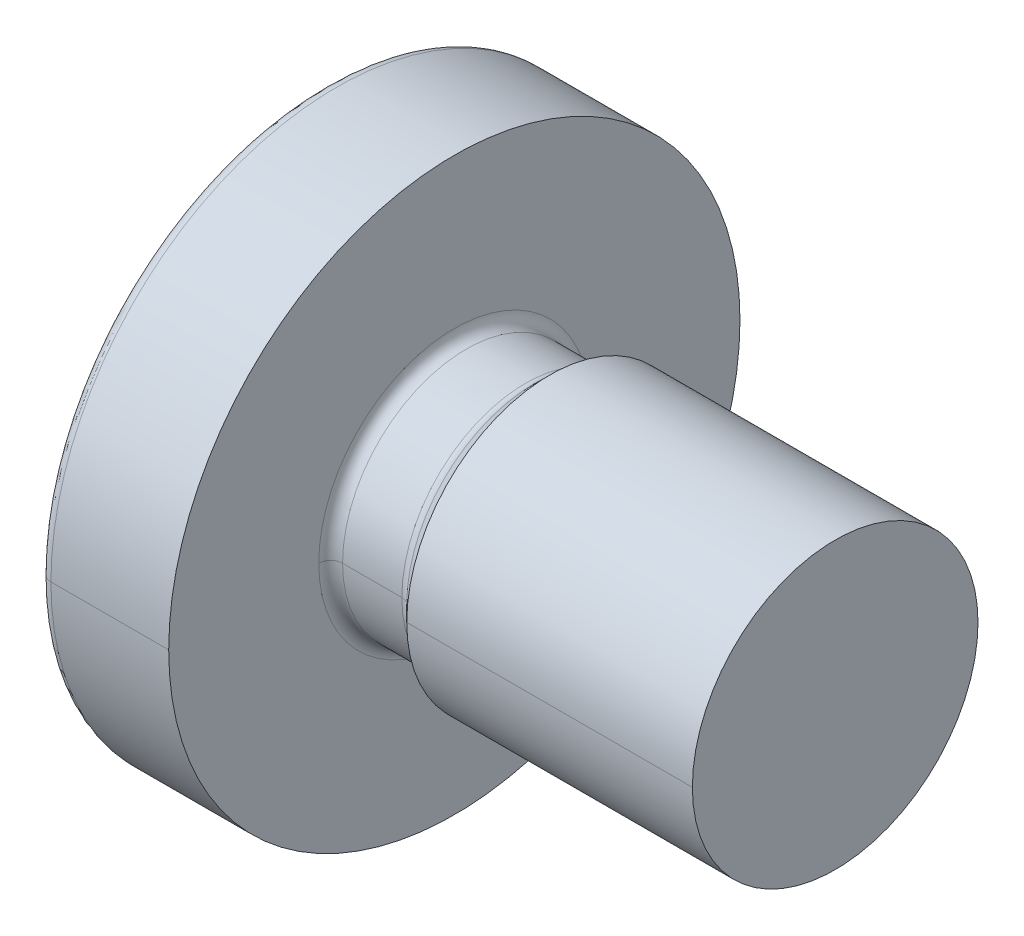
ISO-10303-21;
HEADER;
FILE_DESCRIPTION(('STEP AP214'),'2;1');
FILE_NAME('part.step','',(''),(''),'','','');
FILE_SCHEMA(('AUTOMOTIVE_DESIGN { 1 0 10303 214 1 1 1 1 }'));
ENDSEC;
DATA;
#1=APPLICATION_CONTEXT('core data for automotive mechanical design processes');
#2=APPLICATION_PROTOCOL_DEFINITION('international standard','automotive_design',2000,#1);
#3=PRODUCT_CONTEXT('',#1,'mechanical');
#4=PRODUCT('Part','Part','',(#3));
#5=PRODUCT_RELATED_PRODUCT_CATEGORY('part','',(#4));
#6=PRODUCT_DEFINITION_FORMATION('','',#4);
#7=PRODUCT_DEFINITION_CONTEXT('part definition',#1,'design');
#8=PRODUCT_DEFINITION('design','',#6,#7);
#9=PRODUCT_DEFINITION_SHAPE('','',#8);
#10=(LENGTH_UNIT() NAMED_UNIT(*) SI_UNIT(.MILLI.,.METRE.));
#11=(NAMED_UNIT(*) PLANE_ANGLE_UNIT() SI_UNIT($,.RADIAN.));
#12=(NAMED_UNIT(*) SI_UNIT($,.STERADIAN.) SOLID_ANGLE_UNIT());
#13=UNCERTAINTY_MEASURE_WITH_UNIT(LENGTH_MEASURE(1.E-05),#10,'distance_accuracy_value','');
#14=(GEOMETRIC_REPRESENTATION_CONTEXT(3) GLOBAL_UNCERTAINTY_ASSIGNED_CONTEXT((#13)) GLOBAL_UNIT_ASSIGNED_CONTEXT((#10,
#11,#12)) REPRESENTATION_CONTEXT('',''));
#15=CARTESIAN_POINT('',(0.,0.,0.));
#16=DIRECTION('',(0.,0.,1.));
#17=DIRECTION('',(1.,0.,0.));
#18=AXIS2_PLACEMENT_3D('',#15,#16,#17);
#19=CARTESIAN_POINT('',(4.85,0.,0.));
#20=DIRECTION('',(-1.,0.,0.));
#21=DIRECTION('',(0.,0.,1.));
#22=AXIS2_PLACEMENT_3D('',#19,#20,#21);
#23=TOROIDAL_SURFACE('',#22,2.848,0.25);
#24=CARTESIAN_POINT('',(4.6,0.,0.));
#25=DIRECTION('',(-1.,0.,0.));
#26=DIRECTION('',(0.,0.,1.));
#27=AXIS2_PLACEMENT_3D('',#24,#25,#26);
#28=CIRCLE('',#27,2.848);
#29=CARTESIAN_POINT('',(4.6,0.,-2.848));
#30=VERTEX_POINT('',#29);
#31=CARTESIAN_POINT('',(4.6,0.,2.848));
#32=VERTEX_POINT('',#31);
#33=EDGE_CURVE('E40',#30,#32,#28,.T.);
#34=ORIENTED_EDGE('',*,*,#33,.F.);
#35=CARTESIAN_POINT('',(4.85,0.,-2.848));
#36=DIRECTION('',(0.,1.,0.));
#37=DIRECTION('',(0.,0.,1.));
#38=AXIS2_PLACEMENT_3D('',#35,#36,#37);
#39=CIRCLE('',#38,0.25);
#40=CARTESIAN_POINT('',(4.85,0.,-2.598));
#41=VERTEX_POINT('',#40);
#42=EDGE_CURVE('E10',#30,#41,#39,.T.);
#43=ORIENTED_EDGE('',*,*,#42,.T.);
#44=CARTESIAN_POINT('',(4.85,0.,0.));
#45=DIRECTION('',(1.,0.,0.));
#46=DIRECTION('',(0.,0.,1.));
#47=AXIS2_PLACEMENT_3D('',#44,#45,#46);
#48=CIRCLE('',#47,2.598);
#49=CARTESIAN_POINT('',(4.85,0.,2.598));
#50=VERTEX_POINT('',#49);
#51=EDGE_CURVE('E408',#50,#41,#48,.T.);
#52=ORIENTED_EDGE('',*,*,#51,.F.);
#53=CARTESIAN_POINT('',(4.85,0.,2.848));
#54=DIRECTION('',(0.,-1.,0.));
#55=DIRECTION('',(0.,0.,-1.));
#56=AXIS2_PLACEMENT_3D('',#53,#54,#55);
#57=CIRCLE('',#56,0.25);
#58=EDGE_CURVE('E240',#32,#50,#57,.T.);
#59=ORIENTED_EDGE('',*,*,#58,.F.);
#60=EDGE_LOOP('',(#34,#43,#52,#59));
#61=FACE_BOUND('',#60,.T.);
#62=ADVANCED_FACE('F15',(#61),#23,.F.);
#63=CARTESIAN_POINT('',(6.09444660940673,0.,0.));
#64=DIRECTION('',(-1.,0.,0.));
#65=DIRECTION('',(0.,0.,1.));
#66=AXIS2_PLACEMENT_3D('',#63,#64,#65);
#67=TOROIDAL_SURFACE('',#66,2.848,0.25);
#68=CARTESIAN_POINT('',(6.09444660940673,0.,0.));
#69=DIRECTION('',(-1.,0.,0.));
#70=DIRECTION('',(0.,0.,1.));
#71=AXIS2_PLACEMENT_3D('',#68,#69,#70);
#72=CIRCLE('',#71,2.598);
#73=CARTESIAN_POINT('',(6.09444660940673,0.,-2.598));
#74=VERTEX_POINT('',#73);
#75=CARTESIAN_POINT('',(6.09444660940673,0.,2.598));
#76=VERTEX_POINT('',#75);
#77=EDGE_CURVE('E19',#74,#76,#72,.T.);
#78=ORIENTED_EDGE('',*,*,#77,.F.);
#79=CARTESIAN_POINT('',(6.09444660940673,0.,-2.848));
#80=DIRECTION('',(0.,1.,0.));
#81=DIRECTION('',(0.,0.,1.));
#82=AXIS2_PLACEMENT_3D('',#79,#80,#81);
#83=CIRCLE('',#82,0.25);
#84=CARTESIAN_POINT('',(6.27122330470336,0.,-2.67122330470336));
#85=VERTEX_POINT('',#84);
#86=EDGE_CURVE('E26',#74,#85,#83,.T.);
#87=ORIENTED_EDGE('',*,*,#86,.T.);
#88=CARTESIAN_POINT('',(6.27122330470336,0.,0.));
#89=DIRECTION('',(1.,0.,0.));
#90=DIRECTION('',(0.,0.,-1.));
#91=AXIS2_PLACEMENT_3D('',#88,#89,#90);
#92=CIRCLE('',#91,2.67122330470336);
#93=CARTESIAN_POINT('',(6.27122330470336,0.,2.67122330470336));
#94=VERTEX_POINT('',#93);
#95=EDGE_CURVE('E496',#94,#85,#92,.T.);
#96=ORIENTED_EDGE('',*,*,#95,.F.);
#97=CARTESIAN_POINT('',(6.09444660940673,0.,2.848));
#98=DIRECTION('',(0.,-1.,0.));
#99=DIRECTION('',(0.,0.,-1.));
#100=AXIS2_PLACEMENT_3D('',#97,#98,#99);
#101=CIRCLE('',#100,0.25);
#102=EDGE_CURVE('E244',#76,#94,#101,.T.);
#103=ORIENTED_EDGE('',*,*,#102,.F.);
#104=EDGE_LOOP('',(#78,#87,#96,#103));
#105=FACE_BOUND('',#104,.T.);
#106=ADVANCED_FACE('F566',(#105),#67,.F.);
#107=CARTESIAN_POINT('',(2.12599212598819,0.,0.));
#108=DIRECTION('',(1.,0.,0.));
#109=DIRECTION('',(0.,0.,-1.));
#110=AXIS2_PLACEMENT_3D('',#107,#108,#109);
#111=TOROIDAL_SURFACE('',#110,5.75,0.25);
#112=CARTESIAN_POINT('',(1.92409448819302,0.,0.));
#113=DIRECTION('',(-1.,0.,0.));
#114=DIRECTION('',(0.,0.,-1.));
#115=AXIS2_PLACEMENT_3D('',#112,#113,#114);
#116=CIRCLE('',#115,5.8974358974359);
#117=CARTESIAN_POINT('',(1.92409448819302,0.,5.8974358974359));
#118=VERTEX_POINT('',#117);
#119=CARTESIAN_POINT('',(1.92409448819302,5.8974358974359,0.));
#120=VERTEX_POINT('',#119);
#121=EDGE_CURVE('E299',#118,#120,#116,.T.);
#122=ORIENTED_EDGE('',*,*,#121,.F.);
#123=CARTESIAN_POINT('',(2.12599212598819,0.,5.75));
#124=DIRECTION('',(0.,1.,0.));
#125=DIRECTION('',(0.,0.,1.));
#126=AXIS2_PLACEMENT_3D('',#123,#124,#125);
#127=CIRCLE('',#126,0.25);
#128=CARTESIAN_POINT('',(2.12599212598819,0.,6.));
#129=VERTEX_POINT('',#128);
#130=EDGE_CURVE('E313',#118,#129,#127,.T.);
#131=ORIENTED_EDGE('',*,*,#130,.T.);
#132=CARTESIAN_POINT('',(2.12599212598819,0.,0.));
#133=DIRECTION('',(1.,0.,0.));
#134=DIRECTION('',(0.,0.,-1.));
#135=AXIS2_PLACEMENT_3D('',#132,#133,#134);
#136=CIRCLE('',#135,6.);
#137=CARTESIAN_POINT('',(2.12599212598819,0.,-6.));
#138=VERTEX_POINT('',#137);
#139=EDGE_CURVE('E403',#138,#129,#136,.T.);
#140=ORIENTED_EDGE('',*,*,#139,.F.);
#141=CARTESIAN_POINT('',(2.12599212598819,0.,-5.75));
#142=DIRECTION('',(0.,-1.,0.));
#143=DIRECTION('',(0.,0.,-1.));
#144=AXIS2_PLACEMENT_3D('',#141,#142,#143);
#145=CIRCLE('',#144,0.25);
#146=CARTESIAN_POINT('',(1.92409448819302,0.,-5.8974358974359));
#147=VERTEX_POINT('',#146);
#148=EDGE_CURVE('E422',#147,#138,#145,.T.);
#149=ORIENTED_EDGE('',*,*,#148,.F.);
#150=CARTESIAN_POINT('',(1.92409448819302,0.,0.));
#151=DIRECTION('',(-1.,0.,0.));
#152=DIRECTION('',(0.,0.,-1.));
#153=AXIS2_PLACEMENT_3D('',#150,#151,#152);
#154=CIRCLE('',#153,5.8974358974359);
#155=EDGE_CURVE('E400',#120,#147,#154,.T.);
#156=ORIENTED_EDGE('',*,*,#155,.F.);
#157=EDGE_LOOP('',(#122,#131,#140,#149,#156));
#158=FACE_BOUND('',#157,.T.);
#159=ADVANCED_FACE('F606',(#158),#111,.T.);
#160=CARTESIAN_POINT('',(-3.4420013783492,0.,0.));
#161=DIRECTION('',(-1.,0.,0.));
#162=DIRECTION('',(0.,0.,1.));
#163=AXIS2_PLACEMENT_3D('',#160,#161,#162);
#164=CYLINDRICAL_SURFACE('',#163,3.);
#165=CARTESIAN_POINT('',(12.6,0.,0.));
#166=DIRECTION('',(-1.,0.,0.));
#167=DIRECTION('',(0.,0.,1.));
#168=AXIS2_PLACEMENT_3D('',#165,#166,#167);
#169=CIRCLE('',#168,3.);
#170=CARTESIAN_POINT('',(12.6,0.,3.));
#171=VERTEX_POINT('',#170);
#172=CARTESIAN_POINT('',(12.6,0.,-3.));
#173=VERTEX_POINT('',#172);
#174=EDGE_CURVE('E309',#171,#173,#169,.T.);
#175=ORIENTED_EDGE('',*,*,#174,.T.);
#176=DIRECTION('',(-1.,0.,0.));
#177=VECTOR('',#176,1.);
#178=CARTESIAN_POINT('',(-3.4420013783492,0.,-3.));
#179=LINE('',#178,#177);
#180=CARTESIAN_POINT('',(6.6,0.,-3.));
#181=VERTEX_POINT('',#180);
#182=EDGE_CURVE('E314',#173,#181,#179,.T.);
#183=ORIENTED_EDGE('',*,*,#182,.T.);
#184=CARTESIAN_POINT('',(6.6,0.,0.));
#185=DIRECTION('',(-1.,0.,0.));
#186=DIRECTION('',(0.,0.,1.));
#187=AXIS2_PLACEMENT_3D('',#184,#185,#186);
#188=CIRCLE('',#187,3.);
#189=CARTESIAN_POINT('',(6.6,0.,3.));
#190=VERTEX_POINT('',#189);
#191=EDGE_CURVE('E287',#190,#181,#188,.T.);
#192=ORIENTED_EDGE('',*,*,#191,.F.);
#193=DIRECTION('',(-1.,0.,0.));
#194=VECTOR('',#193,1.);
#195=CARTESIAN_POINT('',(-3.4420013783492,0.,3.));
#196=LINE('',#195,#194);
#197=EDGE_CURVE('E419',#171,#190,#196,.T.);
#198=ORIENTED_EDGE('',*,*,#197,.F.);
#199=EDGE_LOOP('',(#175,#183,#192,#198));
#200=FACE_BOUND('',#199,.T.);
#201=ADVANCED_FACE('F583',(#200),#164,.T.);
#202=CARTESIAN_POINT('',(6.6,0.,0.));
#203=DIRECTION('',(1.,0.,0.));
#204=DIRECTION('',(0.,0.,-1.));
#205=AXIS2_PLACEMENT_3D('',#202,#203,#204);
#206=CONICAL_SURFACE('',#205,3.,0.785398163397442);
#207=CARTESIAN_POINT('',(6.27122330470336,0.,0.));
#208=DIRECTION('',(1.,0.,0.));
#209=DIRECTION('',(0.,0.,-1.));
#210=AXIS2_PLACEMENT_3D('',#207,#208,#209);
#211=CIRCLE('',#210,2.67122330470336);
#212=EDGE_CURVE('E487',#85,#94,#211,.T.);
#213=ORIENTED_EDGE('',*,*,#212,.T.);
#214=DIRECTION('',(0.707106781186552,0.,0.707106781186544));
#215=VECTOR('',#214,1.);
#216=CARTESIAN_POINT('',(6.6,0.,3.));
#217=LINE('',#216,#215);
#218=EDGE_CURVE('E412',#94,#190,#217,.T.);
#219=ORIENTED_EDGE('',*,*,#218,.T.);
#220=ORIENTED_EDGE('',*,*,#191,.T.);
#221=DIRECTION('',(0.707106781186552,0.,-0.707106781186544));
#222=VECTOR('',#221,1.);
#223=CARTESIAN_POINT('',(6.6,0.,-3.));
#224=LINE('',#223,#222);
#225=EDGE_CURVE('E417',#85,#181,#224,.T.);
#226=ORIENTED_EDGE('',*,*,#225,.F.);
#227=EDGE_LOOP('',(#213,#219,#220,#226));
#228=FACE_BOUND('',#227,.T.);
#229=ADVANCED_FACE('F570',(#228),#206,.T.);
#230=CARTESIAN_POINT('',(-3.4420013783492,0.,0.));
#231=DIRECTION('',(-1.,0.,0.));
#232=DIRECTION('',(0.,0.,1.));
#233=AXIS2_PLACEMENT_3D('',#230,#231,#232);
#234=CYLINDRICAL_SURFACE('',#233,2.598);
#235=CARTESIAN_POINT('',(6.09444660940673,0.,0.));
#236=DIRECTION('',(-1.,0.,0.));
#237=DIRECTION('',(0.,0.,1.));
#238=AXIS2_PLACEMENT_3D('',#235,#236,#237);
#239=CIRCLE('',#238,2.598);
#240=EDGE_CURVE('E277',#76,#74,#239,.T.);
#241=ORIENTED_EDGE('',*,*,#240,.T.);
#242=DIRECTION('',(-1.,0.,0.));
#243=VECTOR('',#242,1.);
#244=CARTESIAN_POINT('',(-3.4420013783492,0.,-2.598));
#245=LINE('',#244,#243);
#246=EDGE_CURVE('E273',#74,#41,#245,.T.);
#247=ORIENTED_EDGE('',*,*,#246,.T.);
#248=CARTESIAN_POINT('',(4.85,0.,0.));
#249=DIRECTION('',(1.,0.,0.));
#250=DIRECTION('',(0.,0.,1.));
#251=AXIS2_PLACEMENT_3D('',#248,#249,#250);
#252=CIRCLE('',#251,2.598);
#253=EDGE_CURVE('E218',#41,#50,#252,.T.);
#254=ORIENTED_EDGE('',*,*,#253,.T.);
#255=DIRECTION('',(-1.,0.,0.));
#256=VECTOR('',#255,1.);
#257=CARTESIAN_POINT('',(-3.4420013783492,0.,2.598));
#258=LINE('',#257,#256);
#259=EDGE_CURVE('E404',#76,#50,#258,.T.);
#260=ORIENTED_EDGE('',*,*,#259,.F.);
#261=EDGE_LOOP('',(#241,#247,#254,#260));
#262=FACE_BOUND('',#261,.T.);
#263=ADVANCED_FACE('F17',(#262),#234,.T.);
#264=CARTESIAN_POINT('',(-3.4420013783492,0.,0.));
#265=DIRECTION('',(-1.,0.,0.));
#266=DIRECTION('',(0.,0.,1.));
#267=AXIS2_PLACEMENT_3D('',#264,#265,#266);
#268=CYLINDRICAL_SURFACE('',#267,6.);
#269=CARTESIAN_POINT('',(4.6,0.,0.));
#270=DIRECTION('',(-1.,0.,0.));
#271=DIRECTION('',(0.,0.,1.));
#272=AXIS2_PLACEMENT_3D('',#269,#270,#271);
#273=CIRCLE('',#272,6.);
#274=CARTESIAN_POINT('',(4.6,0.,6.));
#275=VERTEX_POINT('',#274);
#276=CARTESIAN_POINT('',(4.6,0.,-6.));
#277=VERTEX_POINT('',#276);
#278=EDGE_CURVE('E214',#275,#277,#273,.T.);
#279=ORIENTED_EDGE('',*,*,#278,.T.);
#280=DIRECTION('',(-1.,0.,0.));
#281=VECTOR('',#280,1.);
#282=CARTESIAN_POINT('',(-3.4420013783492,0.,-6.));
#283=LINE('',#282,#281);
#284=EDGE_CURVE('E219',#277,#138,#283,.T.);
#285=ORIENTED_EDGE('',*,*,#284,.T.);
#286=ORIENTED_EDGE('',*,*,#139,.T.);
#287=DIRECTION('',(-1.,0.,0.));
#288=VECTOR('',#287,1.);
#289=CARTESIAN_POINT('',(-3.4420013783492,0.,6.));
#290=LINE('',#289,#288);
#291=EDGE_CURVE('E432',#275,#129,#290,.T.);
#292=ORIENTED_EDGE('',*,*,#291,.F.);
#293=EDGE_LOOP('',(#279,#285,#286,#292));
#294=FACE_BOUND('',#293,.T.);
#295=ADVANCED_FACE('F620',(#294),#268,.T.);
#296=CARTESIAN_POINT('',(10.,0.,0.));
#297=DIRECTION('',(0.,0.,-1.));
#298=DIRECTION('',(0.,1.,0.));
#299=AXIS2_PLACEMENT_3D('',#296,#297,#298);
#300=SPHERICAL_SURFACE('',#299,10.);
#301=ORIENTED_EDGE('',*,*,#155,.T.);
#302=CARTESIAN_POINT('',(1.92409448819302,0.,0.));
#303=DIRECTION('',(-1.,0.,0.));
#304=DIRECTION('',(0.,0.,-1.));
#305=AXIS2_PLACEMENT_3D('',#302,#303,#304);
#306=CIRCLE('',#305,5.8974358974359);
#307=CARTESIAN_POINT('',(1.92409448819302,-5.8974358974359,0.));
#308=VERTEX_POINT('',#307);
#309=EDGE_CURVE('E271',#147,#308,#306,.T.);
#310=ORIENTED_EDGE('',*,*,#309,.T.);
#311=CARTESIAN_POINT('',(10.,0.,0.));
#312=DIRECTION('',(0.,0.,-1.));
#313=DIRECTION('',(0.,1.,0.));
#314=AXIS2_PLACEMENT_3D('',#311,#312,#313);
#315=CIRCLE('',#314,10.);
#316=CARTESIAN_POINT('',(0.116806208062503,-1.52396865814495,0.));
#317=VERTEX_POINT('',#316);
#318=EDGE_CURVE('E267',#308,#317,#315,.T.);
#319=ORIENTED_EDGE('',*,*,#318,.T.);
#320=CARTESIAN_POINT('',(10.0479353591547,-0.50242301570466,0.19286212610305));
#321=DIRECTION('',(0.0887201386737619,-0.929898939158985,0.356954758960715));
#322=DIRECTION('',(0.,-0.358367949545296,-0.933580426497203));
#323=AXIS2_PLACEMENT_3D('',#320,#321,#322);
#324=CIRCLE('',#323,9.98539320782852);
#325=CARTESIAN_POINT('',(0.246140300372935,-1.92467766076288,-1.07602827923962));
#326=VERTEX_POINT('',#325);
#327=EDGE_CURVE('E272',#317,#326,#324,.T.);
#328=ORIENTED_EDGE('',*,*,#327,.T.);
#329=CARTESIAN_POINT('',(9.99778730551343,0.0231918286704847,-0.0223960886143359));
#330=DIRECTION('',(0.0684699703771083,-0.717651637719428,0.693028130767562));
#331=DIRECTION('',(0.,-0.694658370458996,-0.719339800338652));
#332=AXIS2_PLACEMENT_3D('',#329,#330,#331);
#333=CIRCLE('',#332,9.99994778277771);
#334=CARTESIAN_POINT('',(0.589318944567111,-2.75177670075754,-1.96641985905463));
#335=VERTEX_POINT('',#334);
#336=EDGE_CURVE('E455',#326,#335,#333,.T.);
#337=ORIENTED_EDGE('',*,*,#336,.T.);
#338=CARTESIAN_POINT('',(9.45863544267171,0.767783130992111,0.767783130992112));
#339=DIRECTION('',(-0.446197814505031,0.632814155313759,0.63281415531376));
#340=DIRECTION('',(0.,-0.707106781186548,0.707106781186547));
#341=AXIS2_PLACEMENT_3D('',#338,#339,#340);
#342=CIRCLE('',#341,9.9261242458271);
#343=CARTESIAN_POINT('',(0.589318944864422,-1.96641985896242,-2.75177670064013));
#344=VERTEX_POINT('',#343);
#345=EDGE_CURVE('E255',#344,#335,#342,.T.);
#346=ORIENTED_EDGE('',*,*,#345,.F.);
#347=CARTESIAN_POINT('',(9.99778730551343,-0.0223960886143297,0.0231918286704783));
#348=DIRECTION('',(0.0684699703771073,0.693028130767562,-0.717651637719428));
#349=DIRECTION('',(0.,0.719339800338652,0.694658370458996));
#350=AXIS2_PLACEMENT_3D('',#347,#348,#349);
#351=CIRCLE('',#350,9.99994778277771);
#352=CARTESIAN_POINT('',(0.246140300295162,-1.07602827923962,-1.9246776607703));
#353=VERTEX_POINT('',#352);
#354=EDGE_CURVE('E258',#344,#353,#351,.T.);
#355=ORIENTED_EDGE('',*,*,#354,.T.);
#356=CARTESIAN_POINT('',(10.0479353591547,0.192862126103053,-0.502423015704669));
#357=DIRECTION('',(0.0887201386737611,0.356954758960714,-0.929898939158986));
#358=DIRECTION('',(0.,0.933580426497204,0.358367949545294));
#359=AXIS2_PLACEMENT_3D('',#356,#357,#358);
#360=CIRCLE('',#359,9.98539320782852);
#361=CARTESIAN_POINT('',(0.116806208062502,0.,-1.52396865814495));
#362=VERTEX_POINT('',#361);
#363=EDGE_CURVE('E193',#353,#362,#360,.T.);
#364=ORIENTED_EDGE('',*,*,#363,.T.);
#365=CARTESIAN_POINT('',(10.0479353591547,-0.192862126103052,-0.502423015704667));
#366=DIRECTION('',(0.0887201386737613,-0.356954758960715,-0.929898939158985));
#367=DIRECTION('',(0.,0.933580426497204,-0.358367949545295));
#368=AXIS2_PLACEMENT_3D('',#365,#366,#367);
#369=CIRCLE('',#368,9.98539320782852);
#370=CARTESIAN_POINT('',(0.246140300372935,1.07602827923962,-1.92467766076288));
#371=VERTEX_POINT('',#370);
#372=EDGE_CURVE('E185',#362,#371,#369,.T.);
#373=ORIENTED_EDGE('',*,*,#372,.T.);
#374=CARTESIAN_POINT('',(9.99778730551343,0.0223960886143316,0.0231918286704803));
#375=DIRECTION('',(0.0684699703771075,-0.693028130767562,-0.717651637719428));
#376=DIRECTION('',(0.,0.719339800338652,-0.694658370458996));
#377=AXIS2_PLACEMENT_3D('',#374,#375,#376);
#378=CIRCLE('',#377,9.99994778277771);
#379=CARTESIAN_POINT('',(0.58931894456711,1.96641985905463,-2.75177670075754));
#380=VERTEX_POINT('',#379);
#381=EDGE_CURVE('E176',#371,#380,#378,.T.);
#382=ORIENTED_EDGE('',*,*,#381,.T.);
#383=CARTESIAN_POINT('',(9.45863544267171,-0.767783130992111,0.767783130992112));
#384=DIRECTION('',(-0.446197814505031,-0.63281415531376,0.63281415531376));
#385=DIRECTION('',(0.,-0.707106781186548,-0.707106781186548));
#386=AXIS2_PLACEMENT_3D('',#383,#384,#385);
#387=CIRCLE('',#386,9.9261242458271);
#388=CARTESIAN_POINT('',(0.58931894456711,2.75177670075754,-1.96641985905463));
#389=VERTEX_POINT('',#388);
#390=EDGE_CURVE('E307',#389,#380,#387,.T.);
#391=ORIENTED_EDGE('',*,*,#390,.F.);
#392=CARTESIAN_POINT('',(9.99778730551343,-0.0231918286704826,-0.0223960886143339));
#393=DIRECTION('',(0.0684699703771079,0.717651637719428,0.693028130767562));
#394=DIRECTION('',(0.,-0.694658370458996,0.719339800338652));
#395=AXIS2_PLACEMENT_3D('',#392,#393,#394);
#396=CIRCLE('',#395,9.99994778277771);
#397=CARTESIAN_POINT('',(0.246140300295164,1.9246776607703,-1.07602827923962));
#398=VERTEX_POINT('',#397);
#399=EDGE_CURVE('E186',#389,#398,#396,.T.);
#400=ORIENTED_EDGE('',*,*,#399,.T.);
#401=CARTESIAN_POINT('',(10.0479353591547,0.502423015704664,0.192862126103051));
#402=DIRECTION('',(0.0887201386737616,0.929898939158985,0.356954758960715));
#403=DIRECTION('',(0.,-0.358367949545295,0.933580426497204));
#404=AXIS2_PLACEMENT_3D('',#401,#402,#403);
#405=CIRCLE('',#404,9.98539320782852);
#406=CARTESIAN_POINT('',(0.116806208062504,1.52396865814495,0.));
#407=VERTEX_POINT('',#406);
#408=EDGE_CURVE('E239',#398,#407,#405,.T.);
#409=ORIENTED_EDGE('',*,*,#408,.T.);
#410=CARTESIAN_POINT('',(10.,0.,0.));
#411=DIRECTION('',(0.,0.,1.));
#412=DIRECTION('',(1.,0.,0.));
#413=AXIS2_PLACEMENT_3D('',#410,#411,#412);
#414=CIRCLE('',#413,10.);
#415=EDGE_CURVE('E466',#120,#407,#414,.T.);
#416=ORIENTED_EDGE('',*,*,#415,.F.);
#417=EDGE_LOOP('',(#301,#310,#319,#328,#337,#346,#355,#364,#373,#382,#391,#400,#409,#416));
#418=FACE_BOUND('',#417,.T.);
#419=ADVANCED_FACE('F190',(#418),#300,.T.);
#420=CARTESIAN_POINT('',(10.,0.,0.));
#421=DIRECTION('',(0.,0.,-1.));
#422=DIRECTION('',(0.,1.,0.));
#423=AXIS2_PLACEMENT_3D('',#420,#421,#422);
#424=SPHERICAL_SURFACE('',#423,10.);
#425=ORIENTED_EDGE('',*,*,#318,.F.);
#426=CARTESIAN_POINT('',(1.92409448819302,0.,0.));
#427=DIRECTION('',(-1.,0.,0.));
#428=DIRECTION('',(0.,0.,-1.));
#429=AXIS2_PLACEMENT_3D('',#426,#427,#428);
#430=CIRCLE('',#429,5.8974358974359);
#431=EDGE_CURVE('E295',#308,#118,#430,.T.);
#432=ORIENTED_EDGE('',*,*,#431,.T.);
#433=ORIENTED_EDGE('',*,*,#121,.T.);
#434=ORIENTED_EDGE('',*,*,#415,.T.);
#435=CARTESIAN_POINT('',(10.0479353591547,0.502423015704664,-0.192862126103051));
#436=DIRECTION('',(0.0887201386737616,0.929898939158985,-0.356954758960715));
#437=DIRECTION('',(0.,0.358367949545295,0.933580426497204));
#438=AXIS2_PLACEMENT_3D('',#435,#436,#437);
#439=CIRCLE('',#438,9.98539320782852);
#440=CARTESIAN_POINT('',(0.246140300372935,1.92467766076288,1.07602827923962));
#441=VERTEX_POINT('',#440);
#442=EDGE_CURVE('E462',#407,#441,#439,.T.);
#443=ORIENTED_EDGE('',*,*,#442,.T.);
#444=CARTESIAN_POINT('',(9.99778730551343,-0.0231918286704828,0.0223960886143341));
#445=DIRECTION('',(0.068469970377108,0.717651637719428,-0.693028130767562));
#446=DIRECTION('',(0.,0.694658370458996,0.719339800338652));
#447=AXIS2_PLACEMENT_3D('',#444,#445,#446);
#448=CIRCLE('',#447,9.99994778277771);
#449=CARTESIAN_POINT('',(0.589318944567112,2.75177670075754,1.96641985905463));
#450=VERTEX_POINT('',#449);
#451=EDGE_CURVE('E303',#441,#450,#448,.T.);
#452=ORIENTED_EDGE('',*,*,#451,.T.);
#453=CARTESIAN_POINT('',(9.45863544267171,-0.767783130992111,-0.767783130992112));
#454=DIRECTION('',(-0.446197814505031,-0.63281415531376,-0.63281415531376));
#455=DIRECTION('',(0.,0.707106781186548,-0.707106781186548));
#456=AXIS2_PLACEMENT_3D('',#453,#454,#455);
#457=CIRCLE('',#456,9.9261242458271);
#458=CARTESIAN_POINT('',(0.589318944864423,1.96641985896241,2.75177670064013));
#459=VERTEX_POINT('',#458);
#460=EDGE_CURVE('E318',#459,#450,#457,.T.);
#461=ORIENTED_EDGE('',*,*,#460,.F.);
#462=CARTESIAN_POINT('',(9.99778730551343,0.0223960886143315,-0.0231918286704802));
#463=DIRECTION('',(0.0684699703771075,-0.693028130767562,0.717651637719428));
#464=DIRECTION('',(0.,-0.719339800338652,-0.694658370458996));
#465=AXIS2_PLACEMENT_3D('',#462,#463,#464);
#466=CIRCLE('',#465,9.99994778277771);
#467=CARTESIAN_POINT('',(0.246140300295162,1.07602827923962,1.9246776607703));
#468=VERTEX_POINT('',#467);
#469=EDGE_CURVE('E300',#459,#468,#466,.T.);
#470=ORIENTED_EDGE('',*,*,#469,.T.);
#471=CARTESIAN_POINT('',(10.0479353591547,-0.192862126103052,0.502423015704667));
#472=DIRECTION('',(0.0887201386737613,-0.356954758960715,0.929898939158985));
#473=DIRECTION('',(0.,-0.933580426497204,-0.358367949545295));
#474=AXIS2_PLACEMENT_3D('',#471,#472,#473);
#475=CIRCLE('',#474,9.98539320782852);
#476=CARTESIAN_POINT('',(0.116806208062501,0.,1.52396865814495));
#477=VERTEX_POINT('',#476);
#478=EDGE_CURVE('E282',#468,#477,#475,.T.);
#479=ORIENTED_EDGE('',*,*,#478,.T.);
#480=CARTESIAN_POINT('',(10.0479353591547,0.192862126103053,0.502423015704669));
#481=DIRECTION('',(0.0887201386737611,0.356954758960714,0.929898939158986));
#482=DIRECTION('',(0.,-0.933580426497204,0.358367949545294));
#483=AXIS2_PLACEMENT_3D('',#480,#481,#482);
#484=CIRCLE('',#483,9.98539320782852);
#485=CARTESIAN_POINT('',(0.246140300372934,-1.07602827923962,1.92467766076288));
#486=VERTEX_POINT('',#485);
#487=EDGE_CURVE('E278',#477,#486,#484,.T.);
#488=ORIENTED_EDGE('',*,*,#487,.T.);
#489=CARTESIAN_POINT('',(9.99778730551343,-0.0223960886143296,-0.0231918286704781));
#490=DIRECTION('',(0.0684699703771073,0.693028130767562,0.717651637719428));
#491=DIRECTION('',(0.,-0.719339800338652,0.694658370458996));
#492=AXIS2_PLACEMENT_3D('',#489,#490,#491);
#493=CIRCLE('',#492,9.99994778277771);
#494=CARTESIAN_POINT('',(0.58931894456711,-1.96641985905463,2.75177670075754));
#495=VERTEX_POINT('',#494);
#496=EDGE_CURVE('E283',#486,#495,#493,.T.);
#497=ORIENTED_EDGE('',*,*,#496,.T.);
#498=CARTESIAN_POINT('',(9.45863544267171,0.767783130992111,-0.767783130992112));
#499=DIRECTION('',(-0.446197814505031,0.632814155313759,-0.63281415531376));
#500=DIRECTION('',(0.,0.707106781186548,0.707106781186547));
#501=AXIS2_PLACEMENT_3D('',#498,#499,#500);
#502=CIRCLE('',#501,9.9261242458271);
#503=CARTESIAN_POINT('',(0.589318944864424,-2.75177670064013,1.96641985896241));
#504=VERTEX_POINT('',#503);
#505=EDGE_CURVE('E234',#504,#495,#502,.T.);
#506=ORIENTED_EDGE('',*,*,#505,.F.);
#507=CARTESIAN_POINT('',(9.99778730551343,0.0231918286704847,0.0223960886143359));
#508=DIRECTION('',(0.0684699703771083,-0.717651637719428,-0.693028130767562));
#509=DIRECTION('',(0.,0.694658370458996,-0.719339800338652));
#510=AXIS2_PLACEMENT_3D('',#507,#508,#509);
#511=CIRCLE('',#510,9.99994778277771);
#512=CARTESIAN_POINT('',(0.246140300295164,-1.9246776607703,1.07602827923962));
#513=VERTEX_POINT('',#512);
#514=EDGE_CURVE('E398',#504,#513,#511,.T.);
#515=ORIENTED_EDGE('',*,*,#514,.T.);
#516=CARTESIAN_POINT('',(10.0479353591547,-0.50242301570466,-0.19286212610305));
#517=DIRECTION('',(0.0887201386737619,-0.929898939158985,-0.356954758960715));
#518=DIRECTION('',(0.,0.358367949545295,-0.933580426497204));
#519=AXIS2_PLACEMENT_3D('',#516,#517,#518);
#520=CIRCLE('',#519,9.98539320782852);
#521=EDGE_CURVE('E395',#513,#317,#520,.T.);
#522=ORIENTED_EDGE('',*,*,#521,.T.);
#523=EDGE_LOOP('',(#425,#432,#433,#434,#443,#452,#461,#470,#479,#488,#497,#506,#515,#522));
#524=FACE_BOUND('',#523,.T.);
#525=ADVANCED_FACE('F619',(#524),#424,.T.);
#526=CARTESIAN_POINT('',(-3.4420013783492,0.,0.));
#527=DIRECTION('',(-1.,0.,0.));
#528=DIRECTION('',(0.,0.,1.));
#529=AXIS2_PLACEMENT_3D('',#526,#527,#528);
#530=CYLINDRICAL_SURFACE('',#529,6.);
#531=ORIENTED_EDGE('',*,*,#284,.F.);
#532=CARTESIAN_POINT('',(4.6,0.,0.));
#533=DIRECTION('',(-1.,0.,0.));
#534=DIRECTION('',(0.,0.,1.));
#535=AXIS2_PLACEMENT_3D('',#532,#533,#534);
#536=CIRCLE('',#535,6.);
#537=EDGE_CURVE('E399',#277,#275,#536,.T.);
#538=ORIENTED_EDGE('',*,*,#537,.T.);
#539=ORIENTED_EDGE('',*,*,#291,.T.);
#540=CARTESIAN_POINT('',(2.12599212598819,0.,0.));
#541=DIRECTION('',(1.,0.,0.));
#542=DIRECTION('',(0.,0.,-1.));
#543=AXIS2_PLACEMENT_3D('',#540,#541,#542);
#544=CIRCLE('',#543,6.);
#545=EDGE_CURVE('E325',#129,#138,#544,.T.);
#546=ORIENTED_EDGE('',*,*,#545,.T.);
#547=EDGE_LOOP('',(#531,#538,#539,#546));
#548=FACE_BOUND('',#547,.T.);
#549=ADVANCED_FACE('F661',(#548),#530,.T.);
#550=CARTESIAN_POINT('',(4.6,6.,0.));
#551=DIRECTION('',(-1.,0.,0.));
#552=DIRECTION('',(0.,0.,1.));
#553=AXIS2_PLACEMENT_3D('',#550,#551,#552);
#554=PLANE('',#553);
#555=ORIENTED_EDGE('',*,*,#278,.F.);
#556=ORIENTED_EDGE('',*,*,#537,.F.);
#557=EDGE_LOOP('',(#555,#556));
#558=FACE_BOUND('',#557,.T.);
#559=CARTESIAN_POINT('',(4.6,0.,0.));
#560=DIRECTION('',(-1.,0.,0.));
#561=DIRECTION('',(0.,0.,1.));
#562=AXIS2_PLACEMENT_3D('',#559,#560,#561);
#563=CIRCLE('',#562,2.848);
#564=EDGE_CURVE('E290',#32,#30,#563,.T.);
#565=ORIENTED_EDGE('',*,*,#564,.T.);
#566=ORIENTED_EDGE('',*,*,#33,.T.);
#567=EDGE_LOOP('',(#565,#566));
#568=FACE_BOUND('',#567,.T.);
#569=ADVANCED_FACE('F616',(#558,#568),#554,.F.);
#570=CARTESIAN_POINT('',(-3.4420013783492,0.,0.));
#571=DIRECTION('',(-1.,0.,0.));
#572=DIRECTION('',(0.,0.,1.));
#573=AXIS2_PLACEMENT_3D('',#570,#571,#572);
#574=CYLINDRICAL_SURFACE('',#573,2.598);
#575=ORIENTED_EDGE('',*,*,#246,.F.);
#576=ORIENTED_EDGE('',*,*,#77,.T.);
#577=ORIENTED_EDGE('',*,*,#259,.T.);
#578=ORIENTED_EDGE('',*,*,#51,.T.);
#579=EDGE_LOOP('',(#575,#576,#577,#578));
#580=FACE_BOUND('',#579,.T.);
#581=ADVANCED_FACE('F555',(#580),#574,.T.);
#582=CARTESIAN_POINT('',(6.6,0.,0.));
#583=DIRECTION('',(1.,0.,0.));
#584=DIRECTION('',(0.,0.,-1.));
#585=AXIS2_PLACEMENT_3D('',#582,#583,#584);
#586=CONICAL_SURFACE('',#585,3.,0.785398163397442);
#587=ORIENTED_EDGE('',*,*,#218,.F.);
#588=ORIENTED_EDGE('',*,*,#95,.T.);
#589=ORIENTED_EDGE('',*,*,#225,.T.);
#590=CARTESIAN_POINT('',(6.6,0.,0.));
#591=DIRECTION('',(-1.,0.,0.));
#592=DIRECTION('',(0.,0.,1.));
#593=AXIS2_PLACEMENT_3D('',#590,#591,#592);
#594=CIRCLE('',#593,3.);
#595=EDGE_CURVE('E413',#181,#190,#594,.T.);
#596=ORIENTED_EDGE('',*,*,#595,.T.);
#597=EDGE_LOOP('',(#587,#588,#589,#596));
#598=FACE_BOUND('',#597,.T.);
#599=ADVANCED_FACE('F574',(#598),#586,.T.);
#600=CARTESIAN_POINT('',(-3.4420013783492,0.,0.));
#601=DIRECTION('',(-1.,0.,0.));
#602=DIRECTION('',(0.,0.,1.));
#603=AXIS2_PLACEMENT_3D('',#600,#601,#602);
#604=CYLINDRICAL_SURFACE('',#603,3.);
#605=ORIENTED_EDGE('',*,*,#182,.F.);
#606=CARTESIAN_POINT('',(12.6,0.,0.));
#607=DIRECTION('',(-1.,0.,0.));
#608=DIRECTION('',(0.,0.,1.));
#609=AXIS2_PLACEMENT_3D('',#606,#607,#608);
#610=CIRCLE('',#609,3.);
#611=EDGE_CURVE('E418',#173,#171,#610,.T.);
#612=ORIENTED_EDGE('',*,*,#611,.T.);
#613=ORIENTED_EDGE('',*,*,#197,.T.);
#614=ORIENTED_EDGE('',*,*,#595,.F.);
#615=EDGE_LOOP('',(#605,#612,#613,#614));
#616=FACE_BOUND('',#615,.T.);
#617=ADVANCED_FACE('F578',(#616),#604,.T.);
#618=CARTESIAN_POINT('',(12.6,0.,0.));
#619=DIRECTION('',(-1.,0.,0.));
#620=DIRECTION('',(0.,0.,1.));
#621=AXIS2_PLACEMENT_3D('',#618,#619,#620);
#622=PLANE('',#621);
#623=ORIENTED_EDGE('',*,*,#174,.F.);
#624=ORIENTED_EDGE('',*,*,#611,.F.);
#625=EDGE_LOOP('',(#623,#624));
#626=FACE_BOUND('',#625,.T.);
#627=ADVANCED_FACE('F587',(#626),#622,.F.);
#628=CARTESIAN_POINT('',(2.12599212598819,0.,0.));
#629=DIRECTION('',(1.,0.,0.));
#630=DIRECTION('',(0.,0.,-1.));
#631=AXIS2_PLACEMENT_3D('',#628,#629,#630);
#632=TOROIDAL_SURFACE('',#631,5.75,0.25);
#633=ORIENTED_EDGE('',*,*,#130,.F.);
#634=ORIENTED_EDGE('',*,*,#431,.F.);
#635=ORIENTED_EDGE('',*,*,#309,.F.);
#636=ORIENTED_EDGE('',*,*,#148,.T.);
#637=ORIENTED_EDGE('',*,*,#545,.F.);
#638=EDGE_LOOP('',(#633,#634,#635,#636,#637));
#639=FACE_BOUND('',#638,.T.);
#640=ADVANCED_FACE('F589',(#639),#632,.T.);
#641=CARTESIAN_POINT('',(6.09444660940673,0.,0.));
#642=DIRECTION('',(-1.,0.,0.));
#643=DIRECTION('',(0.,0.,1.));
#644=AXIS2_PLACEMENT_3D('',#641,#642,#643);
#645=TOROIDAL_SURFACE('',#644,2.848,0.25);
#646=ORIENTED_EDGE('',*,*,#86,.F.);
#647=ORIENTED_EDGE('',*,*,#240,.F.);
#648=ORIENTED_EDGE('',*,*,#102,.T.);
#649=ORIENTED_EDGE('',*,*,#212,.F.);
#650=EDGE_LOOP('',(#646,#647,#648,#649));
#651=FACE_BOUND('',#650,.T.);
#652=ADVANCED_FACE('F562',(#651),#645,.F.);
#653=CARTESIAN_POINT('',(4.85,0.,0.));
#654=DIRECTION('',(-1.,0.,0.));
#655=DIRECTION('',(0.,0.,1.));
#656=AXIS2_PLACEMENT_3D('',#653,#654,#655);
#657=TOROIDAL_SURFACE('',#656,2.848,0.25);
#658=ORIENTED_EDGE('',*,*,#42,.F.);
#659=ORIENTED_EDGE('',*,*,#564,.F.);
#660=ORIENTED_EDGE('',*,*,#58,.T.);
#661=ORIENTED_EDGE('',*,*,#253,.F.);
#662=EDGE_LOOP('',(#658,#659,#660,#661));
#663=FACE_BOUND('',#662,.T.);
#664=ADVANCED_FACE('F627',(#663),#657,.F.);
#665=CARTESIAN_POINT('',(0.,2.98451849970904,-2.14920736346058));
#666=DIRECTION('',(0.0684699703771079,0.717651637719428,0.693028130767562));
#667=DIRECTION('',(0.99515489379392,0.,-0.098319567523525));
#668=AXIS2_PLACEMENT_3D('',#665,#666,#667);
#669=PLANE('',#668);
#670=DIRECTION('',(-0.893649599669889,0.352932172598372,-0.277180941904094));
#671=VECTOR('',#670,1.);
#672=CARTESIAN_POINT('',(1.73,2.30128352839508,-1.6126178213501));
#673=LINE('',#672,#671);
#674=CARTESIAN_POINT('',(3.46,1.61804855708113,-1.07602827923962));
#675=VERTEX_POINT('',#674);
#676=EDGE_CURVE('E229',#675,#389,#673,.T.);
#677=ORIENTED_EDGE('',*,*,#676,.F.);
#678=DIRECTION('',(0.995479460535586,-0.0949770690839543,0.));
#679=VECTOR('',#678,1.);
#680=CARTESIAN_POINT('',(1.73,1.78310503090013,-1.07602827923962));
#681=LINE('',#680,#679);
#682=EDGE_CURVE('E245',#398,#675,#681,.T.);
#683=ORIENTED_EDGE('',*,*,#682,.F.);
#684=ORIENTED_EDGE('',*,*,#399,.F.);
#685=EDGE_LOOP('',(#677,#683,#684));
#686=FACE_BOUND('',#685,.T.);
#687=ADVANCED_FACE('F630',(#686),#669,.F.);
#688=CARTESIAN_POINT('',(0.,1.535112947638,0.));
#689=DIRECTION('',(0.0887201386737616,0.929898939158985,0.356954758960715));
#690=DIRECTION('',(0.970473313784807,0.,-0.241208514011292));
#691=AXIS2_PLACEMENT_3D('',#688,#689,#690);
#692=PLANE('',#691);
#693=ORIENTED_EDGE('',*,*,#682,.T.);
#694=DIRECTION('',(0.,-0.358367949545295,0.933580426497204));
#695=VECTOR('',#694,1.);
#696=CARTESIAN_POINT('',(3.46,1.205,0.));
#697=LINE('',#696,#695);
#698=CARTESIAN_POINT('',(3.46,1.205,0.));
#699=VERTEX_POINT('',#698);
#700=EDGE_CURVE('E480',#675,#699,#697,.T.);
#701=ORIENTED_EDGE('',*,*,#700,.T.);
#702=DIRECTION('',(0.995479460535586,-0.0949770690839541,0.));
#703=VECTOR('',#702,1.);
#704=CARTESIAN_POINT('',(0.,1.535112947638,0.));
#705=LINE('',#704,#703);
#706=EDGE_CURVE('E225',#407,#699,#705,.T.);
#707=ORIENTED_EDGE('',*,*,#706,.F.);
#708=ORIENTED_EDGE('',*,*,#408,.F.);
#709=EDGE_LOOP('',(#693,#701,#707,#708));
#710=FACE_BOUND('',#709,.T.);
#711=ADVANCED_FACE('F633',(#710),#692,.F.);
#712=CARTESIAN_POINT('',(3.46,1.61804855708113,-1.07602827923962));
#713=DIRECTION('',(-0.446197814505031,-0.63281415531376,0.63281415531376));
#714=DIRECTION('',(-0.817268653268361,0.576256842375793,0.));
#715=AXIS2_PLACEMENT_3D('',#712,#713,#714);
#716=PLANE('',#715);
#717=ORIENTED_EDGE('',*,*,#390,.T.);
#718=DIRECTION('',(0.893649599669889,-0.277180941904093,0.352932172598372));
#719=VECTOR('',#718,1.);
#720=CARTESIAN_POINT('',(1.73,1.6126178213501,-2.30128352839508));
#721=LINE('',#720,#719);
#722=CARTESIAN_POINT('',(3.46,1.07602827923962,-1.61804855708113));
#723=VERTEX_POINT('',#722);
#724=EDGE_CURVE('E182',#380,#723,#721,.T.);
#725=ORIENTED_EDGE('',*,*,#724,.T.);
#726=DIRECTION('',(0.,0.707106781186548,0.707106781186547));
#727=VECTOR('',#726,1.);
#728=CARTESIAN_POINT('',(3.46,1.61804855708113,-1.07602827923962));
#729=LINE('',#728,#727);
#730=EDGE_CURVE('E308',#723,#675,#729,.T.);
#731=ORIENTED_EDGE('',*,*,#730,.T.);
#732=ORIENTED_EDGE('',*,*,#676,.T.);
#733=EDGE_LOOP('',(#717,#725,#731,#732));
#734=FACE_BOUND('',#733,.T.);
#735=ADVANCED_FACE('F645',(#734),#716,.T.);
#736=CARTESIAN_POINT('',(0.,1.535112947638,0.));
#737=DIRECTION('',(0.0887201386737616,0.929898939158985,-0.356954758960715));
#738=DIRECTION('',(-0.970473313784807,0.,-0.241208514011292));
#739=AXIS2_PLACEMENT_3D('',#736,#737,#738);
#740=PLANE('',#739);
#741=ORIENTED_EDGE('',*,*,#706,.T.);
#742=DIRECTION('',(0.,0.358367949545295,0.933580426497204));
#743=VECTOR('',#742,1.);
#744=CARTESIAN_POINT('',(3.46,1.205,0.));
#745=LINE('',#744,#743);
#746=CARTESIAN_POINT('',(3.46,1.61804855708113,1.07602827923962));
#747=VERTEX_POINT('',#746);
#748=EDGE_CURVE('E230',#699,#747,#745,.T.);
#749=ORIENTED_EDGE('',*,*,#748,.T.);
#750=DIRECTION('',(0.995479460535586,-0.0949770690839541,0.));
#751=VECTOR('',#750,1.);
#752=CARTESIAN_POINT('',(0.,1.94816150471912,1.07602827923962));
#753=LINE('',#752,#751);
#754=EDGE_CURVE('E451',#441,#747,#753,.T.);
#755=ORIENTED_EDGE('',*,*,#754,.F.);
#756=ORIENTED_EDGE('',*,*,#442,.F.);
#757=EDGE_LOOP('',(#741,#749,#755,#756));
#758=FACE_BOUND('',#757,.T.);
#759=ADVANCED_FACE('F648',(#758),#740,.F.);
#760=CARTESIAN_POINT('',(0.,1.94816150471912,1.07602827923962));
#761=DIRECTION('',(0.068469970377108,0.717651637719428,-0.693028130767562));
#762=DIRECTION('',(-0.99515489379392,0.,-0.0983195675235251));
#763=AXIS2_PLACEMENT_3D('',#760,#761,#762);
#764=PLANE('',#763);
#765=ORIENTED_EDGE('',*,*,#754,.T.);
#766=DIRECTION('',(0.893649599669889,-0.352932172598373,-0.277180941904093));
#767=VECTOR('',#766,1.);
#768=CARTESIAN_POINT('',(1.73,2.30128352839508,1.6126178213501));
#769=LINE('',#768,#767);
#770=EDGE_CURVE('E315',#450,#747,#769,.T.);
#771=ORIENTED_EDGE('',*,*,#770,.F.);
#772=ORIENTED_EDGE('',*,*,#451,.F.);
#773=EDGE_LOOP('',(#765,#771,#772));
#774=FACE_BOUND('',#773,.T.);
#775=ADVANCED_FACE('F652',(#774),#764,.F.);
#776=CARTESIAN_POINT('',(3.46,1.07602827923962,1.61804855708113));
#777=DIRECTION('',(-0.446197814505031,-0.63281415531376,-0.63281415531376));
#778=DIRECTION('',(0.,-0.707106781186548,0.707106781186548));
#779=AXIS2_PLACEMENT_3D('',#776,#777,#778);
#780=PLANE('',#779);
#781=ORIENTED_EDGE('',*,*,#460,.T.);
#782=ORIENTED_EDGE('',*,*,#770,.T.);
#783=DIRECTION('',(0.,-0.707106781186548,0.707106781186547));
#784=VECTOR('',#783,1.);
#785=CARTESIAN_POINT('',(3.46,1.61804855708113,1.07602827923962));
#786=LINE('',#785,#784);
#787=CARTESIAN_POINT('',(3.46,1.07602827923962,1.61804855708113));
#788=VERTEX_POINT('',#787);
#789=EDGE_CURVE('E319',#747,#788,#786,.T.);
#790=ORIENTED_EDGE('',*,*,#789,.T.);
#791=DIRECTION('',(-0.893649599669889,0.277180941904094,0.352932172598372));
#792=VECTOR('',#791,1.);
#793=CARTESIAN_POINT('',(1.73,1.6126178213501,2.30128352839508));
#794=LINE('',#793,#792);
#795=EDGE_CURVE('E326',#788,#459,#794,.T.);
#796=ORIENTED_EDGE('',*,*,#795,.T.);
#797=EDGE_LOOP('',(#781,#782,#790,#796));
#798=FACE_BOUND('',#797,.T.);
#799=ADVANCED_FACE('F680',(#798),#780,.T.);
#800=CARTESIAN_POINT('',(0.,2.14920736346058,2.98451849970904));
#801=DIRECTION('',(0.0684699703771075,-0.693028130767562,0.717651637719428));
#802=DIRECTION('',(-0.99515489379392,-0.0983195675235244,0.));
#803=AXIS2_PLACEMENT_3D('',#800,#801,#802);
#804=PLANE('',#803);
#805=ORIENTED_EDGE('',*,*,#795,.F.);
#806=DIRECTION('',(0.995479460535586,0.,-0.0949770690839539));
#807=VECTOR('',#806,1.);
#808=CARTESIAN_POINT('',(1.73,1.07602827923962,1.78310503090013));
#809=LINE('',#808,#807);
#810=EDGE_CURVE('E330',#468,#788,#809,.T.);
#811=ORIENTED_EDGE('',*,*,#810,.F.);
#812=ORIENTED_EDGE('',*,*,#469,.F.);
#813=EDGE_LOOP('',(#805,#811,#812));
#814=FACE_BOUND('',#813,.T.);
#815=ADVANCED_FACE('F659',(#814),#804,.F.);
#816=CARTESIAN_POINT('',(0.,0.,1.535112947638));
#817=DIRECTION('',(0.0887201386737613,-0.356954758960715,0.929898939158985));
#818=DIRECTION('',(-0.970473313784807,-0.241208514011292,0.));
#819=AXIS2_PLACEMENT_3D('',#816,#817,#818);
#820=PLANE('',#819);
#821=ORIENTED_EDGE('',*,*,#810,.T.);
#822=DIRECTION('',(0.,-0.933580426497203,-0.358367949545296));
#823=VECTOR('',#822,1.);
#824=CARTESIAN_POINT('',(3.46,0.,1.205));
#825=LINE('',#824,#823);
#826=CARTESIAN_POINT('',(3.46,0.,1.205));
#827=VERTEX_POINT('',#826);
#828=EDGE_CURVE('E387',#788,#827,#825,.T.);
#829=ORIENTED_EDGE('',*,*,#828,.T.);
#830=DIRECTION('',(0.995479460535586,0.,-0.0949770690839539));
#831=VECTOR('',#830,1.);
#832=CARTESIAN_POINT('',(0.,0.,1.535112947638));
#833=LINE('',#832,#831);
#834=EDGE_CURVE('E379',#477,#827,#833,.T.);
#835=ORIENTED_EDGE('',*,*,#834,.F.);
#836=ORIENTED_EDGE('',*,*,#478,.F.);
#837=EDGE_LOOP('',(#821,#829,#835,#836));
#838=FACE_BOUND('',#837,.T.);
#839=ADVANCED_FACE('F613',(#838),#820,.F.);
#840=CARTESIAN_POINT('',(0.,0.,1.535112947638));
#841=DIRECTION('',(0.0887201386737611,0.356954758960714,0.929898939158986));
#842=DIRECTION('',(0.970473313784807,-0.241208514011292,0.));
#843=AXIS2_PLACEMENT_3D('',#840,#841,#842);
#844=PLANE('',#843);
#845=ORIENTED_EDGE('',*,*,#834,.T.);
#846=DIRECTION('',(0.,-0.933580426497203,0.358367949545296));
#847=VECTOR('',#846,1.);
#848=CARTESIAN_POINT('',(3.46,0.,1.205));
#849=LINE('',#848,#847);
#850=CARTESIAN_POINT('',(3.46,-1.07602827923962,1.61804855708113));
#851=VERTEX_POINT('',#850);
#852=EDGE_CURVE('E376',#827,#851,#849,.T.);
#853=ORIENTED_EDGE('',*,*,#852,.T.);
#854=DIRECTION('',(0.995479460535586,0.,-0.0949770690839537));
#855=VECTOR('',#854,1.);
#856=CARTESIAN_POINT('',(0.,-1.07602827923962,1.94816150471912));
#857=LINE('',#856,#855);
#858=EDGE_CURVE('E294',#486,#851,#857,.T.);
#859=ORIENTED_EDGE('',*,*,#858,.F.);
#860=ORIENTED_EDGE('',*,*,#487,.F.);
#861=EDGE_LOOP('',(#845,#853,#859,#860));
#862=FACE_BOUND('',#861,.T.);
#863=ADVANCED_FACE('F609',(#862),#844,.F.);
#864=CARTESIAN_POINT('',(0.,-1.07602827923962,1.94816150471912));
#865=DIRECTION('',(0.0684699703771073,0.693028130767562,0.717651637719428));
#866=DIRECTION('',(0.99515489379392,-0.0983195675235241,0.));
#867=AXIS2_PLACEMENT_3D('',#864,#865,#866);
#868=PLANE('',#867);
#869=ORIENTED_EDGE('',*,*,#858,.T.);
#870=DIRECTION('',(0.893649599669889,0.277180941904094,-0.352932172598372));
#871=VECTOR('',#870,1.);
#872=CARTESIAN_POINT('',(1.73,-1.6126178213501,2.30128352839508));
#873=LINE('',#872,#871);
#874=EDGE_CURVE('E231',#495,#851,#873,.T.);
#875=ORIENTED_EDGE('',*,*,#874,.F.);
#876=ORIENTED_EDGE('',*,*,#496,.F.);
#877=EDGE_LOOP('',(#869,#875,#876));
#878=FACE_BOUND('',#877,.T.);
#879=ADVANCED_FACE('F612',(#878),#868,.F.);
#880=CARTESIAN_POINT('',(3.46,-1.61804855708113,1.07602827923962));
#881=DIRECTION('',(-0.44619781450503,0.63281415531376,-0.63281415531376));
#882=DIRECTION('',(-0.817268653268361,0.,0.576256842375793));
#883=AXIS2_PLACEMENT_3D('',#880,#881,#882);
#884=PLANE('',#883);
#885=ORIENTED_EDGE('',*,*,#505,.T.);
#886=ORIENTED_EDGE('',*,*,#874,.T.);
#887=DIRECTION('',(0.,-0.707106781186548,-0.707106781186547));
#888=VECTOR('',#887,1.);
#889=CARTESIAN_POINT('',(3.46,-1.61804855708113,1.07602827923962));
#890=LINE('',#889,#888);
#891=CARTESIAN_POINT('',(3.46,-1.61804855708113,1.07602827923962));
#892=VERTEX_POINT('',#891);
#893=EDGE_CURVE('E235',#851,#892,#890,.T.);
#894=ORIENTED_EDGE('',*,*,#893,.T.);
#895=DIRECTION('',(-0.893649599669889,-0.352932172598373,0.277180941904093));
#896=VECTOR('',#895,1.);
#897=CARTESIAN_POINT('',(1.73,-2.30128352839508,1.6126178213501));
#898=LINE('',#897,#896);
#899=EDGE_CURVE('E266',#892,#504,#898,.T.);
#900=ORIENTED_EDGE('',*,*,#899,.T.);
#901=EDGE_LOOP('',(#885,#886,#894,#900));
#902=FACE_BOUND('',#901,.T.);
#903=ADVANCED_FACE('F675',(#902),#884,.T.);
#904=CARTESIAN_POINT('',(0.,-2.98451849970904,2.14920736346058));
#905=DIRECTION('',(0.0684699703771083,-0.717651637719428,-0.693028130767562));
#906=DIRECTION('',(0.,0.694658370458996,-0.719339800338652));
#907=AXIS2_PLACEMENT_3D('',#904,#905,#906);
#908=PLANE('',#907);
#909=ORIENTED_EDGE('',*,*,#899,.F.);
#910=DIRECTION('',(0.995479460535586,0.0949770690839545,0.));
#911=VECTOR('',#910,1.);
#912=CARTESIAN_POINT('',(1.73,-1.78310503090013,1.07602827923962));
#913=LINE('',#912,#911);
#914=EDGE_CURVE('E339',#513,#892,#913,.T.);
#915=ORIENTED_EDGE('',*,*,#914,.F.);
#916=ORIENTED_EDGE('',*,*,#514,.F.);
#917=EDGE_LOOP('',(#909,#915,#916));
#918=FACE_BOUND('',#917,.T.);
#919=ADVANCED_FACE('F624',(#918),#908,.F.);
#920=CARTESIAN_POINT('',(0.,-1.535112947638,0.));
#921=DIRECTION('',(0.088720138673762,-0.929898939158985,-0.356954758960715));
#922=DIRECTION('',(0.,0.358367949545295,-0.933580426497204));
#923=AXIS2_PLACEMENT_3D('',#920,#921,#922);
#924=PLANE('',#923);
#925=ORIENTED_EDGE('',*,*,#914,.T.);
#926=DIRECTION('',(0.,0.358367949545295,-0.933580426497204));
#927=VECTOR('',#926,1.);
#928=CARTESIAN_POINT('',(3.46,-1.205,0.));
#929=LINE('',#928,#927);
#930=CARTESIAN_POINT('',(3.46,-1.205,0.));
#931=VERTEX_POINT('',#930);
#932=EDGE_CURVE('E212',#892,#931,#929,.T.);
#933=ORIENTED_EDGE('',*,*,#932,.T.);
#934=DIRECTION('',(0.995479460535586,0.0949770690839544,0.));
#935=VECTOR('',#934,1.);
#936=CARTESIAN_POINT('',(0.,-1.535112947638,0.));
#937=LINE('',#936,#935);
#938=EDGE_CURVE('E246',#317,#931,#937,.T.);
#939=ORIENTED_EDGE('',*,*,#938,.F.);
#940=ORIENTED_EDGE('',*,*,#521,.F.);
#941=EDGE_LOOP('',(#925,#933,#939,#940));
#942=FACE_BOUND('',#941,.T.);
#943=ADVANCED_FACE('F357',(#942),#924,.F.);
#944=CARTESIAN_POINT('',(0.,-1.535112947638,0.));
#945=DIRECTION('',(0.088720138673762,-0.929898939158985,0.356954758960715));
#946=DIRECTION('',(-0.995479460535586,-0.0949770690839545,0.));
#947=AXIS2_PLACEMENT_3D('',#944,#945,#946);
#948=PLANE('',#947);
#949=ORIENTED_EDGE('',*,*,#938,.T.);
#950=DIRECTION('',(0.,-0.358367949545295,-0.933580426497204));
#951=VECTOR('',#950,1.);
#952=CARTESIAN_POINT('',(3.46,-1.205,0.));
#953=LINE('',#952,#951);
#954=CARTESIAN_POINT('',(3.46,-1.61804855708113,-1.07602827923962));
#955=VERTEX_POINT('',#954);
#956=EDGE_CURVE('E249',#931,#955,#953,.T.);
#957=ORIENTED_EDGE('',*,*,#956,.T.);
#958=DIRECTION('',(0.995479460535586,0.0949770690839544,0.));
#959=VECTOR('',#958,1.);
#960=CARTESIAN_POINT('',(0.,-1.94816150471912,-1.07602827923962));
#961=LINE('',#960,#959);
#962=EDGE_CURVE('E251',#326,#955,#961,.T.);
#963=ORIENTED_EDGE('',*,*,#962,.F.);
#964=ORIENTED_EDGE('',*,*,#327,.F.);
#965=EDGE_LOOP('',(#949,#957,#963,#964));
#966=FACE_BOUND('',#965,.T.);
#967=ADVANCED_FACE('F623',(#966),#948,.F.);
#968=CARTESIAN_POINT('',(0.,-1.94816150471912,-1.07602827923962));
#969=DIRECTION('',(0.0684699703771082,-0.717651637719428,0.693028130767562));
#970=DIRECTION('',(-0.995479460535586,-0.0949770690839546,0.));
#971=AXIS2_PLACEMENT_3D('',#968,#969,#970);
#972=PLANE('',#971);
#973=ORIENTED_EDGE('',*,*,#962,.T.);
#974=DIRECTION('',(0.893649599669889,0.352932172598373,0.277180941904093));
#975=VECTOR('',#974,1.);
#976=CARTESIAN_POINT('',(1.73,-2.30128352839508,-1.6126178213501));
#977=LINE('',#976,#975);
#978=EDGE_CURVE('E259',#335,#955,#977,.T.);
#979=ORIENTED_EDGE('',*,*,#978,.F.);
#980=ORIENTED_EDGE('',*,*,#336,.F.);
#981=EDGE_LOOP('',(#973,#979,#980));
#982=FACE_BOUND('',#981,.T.);
#983=ADVANCED_FACE('F635',(#982),#972,.F.);
#984=CARTESIAN_POINT('',(3.46,-1.07602827923962,-1.61804855708113));
#985=DIRECTION('',(-0.446197814505031,0.632814155313759,0.63281415531376));
#986=DIRECTION('',(0.817268653268361,0.576256842375794,0.));
#987=AXIS2_PLACEMENT_3D('',#984,#985,#986);
#988=PLANE('',#987);
#989=ORIENTED_EDGE('',*,*,#345,.T.);
#990=ORIENTED_EDGE('',*,*,#978,.T.);
#991=DIRECTION('',(0.,0.707106781186548,-0.707106781186547));
#992=VECTOR('',#991,1.);
#993=CARTESIAN_POINT('',(3.46,-1.61804855708113,-1.07602827923962));
#994=LINE('',#993,#992);
#995=CARTESIAN_POINT('',(3.46,-1.07602827923962,-1.61804855708113));
#996=VERTEX_POINT('',#995);
#997=EDGE_CURVE('E262',#955,#996,#994,.T.);
#998=ORIENTED_EDGE('',*,*,#997,.T.);
#999=DIRECTION('',(-0.893649599669889,-0.277180941904094,-0.352932172598372));
#1000=VECTOR('',#999,1.);
#1001=CARTESIAN_POINT('',(1.73,-1.6126178213501,-2.30128352839508));
#1002=LINE('',#1001,#1000);
#1003=EDGE_CURVE('E438',#996,#344,#1002,.T.);
#1004=ORIENTED_EDGE('',*,*,#1003,.T.);
#1005=EDGE_LOOP('',(#989,#990,#998,#1004));
#1006=FACE_BOUND('',#1005,.T.);
#1007=ADVANCED_FACE('F638',(#1006),#988,.T.);
#1008=CARTESIAN_POINT('',(0.,-2.14920736346059,-2.98451849970903));
#1009=DIRECTION('',(0.0684699703771073,0.693028130767562,-0.717651637719428));
#1010=DIRECTION('',(-0.995479460535586,0.,-0.0949770690839533));
#1011=AXIS2_PLACEMENT_3D('',#1008,#1009,#1010);
#1012=PLANE('',#1011);
#1013=ORIENTED_EDGE('',*,*,#1003,.F.);
#1014=DIRECTION('',(0.995479460535586,0.,0.0949770690839537));
#1015=VECTOR('',#1014,1.);
#1016=CARTESIAN_POINT('',(1.73,-1.07602827923962,-1.78310503090013));
#1017=LINE('',#1016,#1015);
#1018=EDGE_CURVE('E224',#353,#996,#1017,.T.);
#1019=ORIENTED_EDGE('',*,*,#1018,.F.);
#1020=ORIENTED_EDGE('',*,*,#354,.F.);
#1021=EDGE_LOOP('',(#1013,#1019,#1020));
#1022=FACE_BOUND('',#1021,.T.);
#1023=ADVANCED_FACE('F640',(#1022),#1012,.F.);
#1024=CARTESIAN_POINT('',(0.,0.,-1.535112947638));
#1025=DIRECTION('',(0.0887201386737611,0.356954758960714,-0.929898939158986));
#1026=DIRECTION('',(-0.995479460535586,0.,-0.0949770690839536));
#1027=AXIS2_PLACEMENT_3D('',#1024,#1025,#1026);
#1028=PLANE('',#1027);
#1029=ORIENTED_EDGE('',*,*,#1018,.T.);
#1030=DIRECTION('',(0.,0.933580426497203,0.358367949545296));
#1031=VECTOR('',#1030,1.);
#1032=CARTESIAN_POINT('',(3.46,0.,-1.205));
#1033=LINE('',#1032,#1031);
#1034=CARTESIAN_POINT('',(3.46,0.,-1.205));
#1035=VERTEX_POINT('',#1034);
#1036=EDGE_CURVE('E220',#996,#1035,#1033,.T.);
#1037=ORIENTED_EDGE('',*,*,#1036,.T.);
#1038=DIRECTION('',(0.995479460535586,0.,0.0949770690839537));
#1039=VECTOR('',#1038,1.);
#1040=CARTESIAN_POINT('',(0.,0.,-1.535112947638));
#1041=LINE('',#1040,#1039);
#1042=EDGE_CURVE('E208',#362,#1035,#1041,.T.);
#1043=ORIENTED_EDGE('',*,*,#1042,.F.);
#1044=ORIENTED_EDGE('',*,*,#363,.F.);
#1045=EDGE_LOOP('',(#1029,#1037,#1043,#1044));
#1046=FACE_BOUND('',#1045,.T.);
#1047=ADVANCED_FACE('F643',(#1046),#1028,.F.);
#1048=CARTESIAN_POINT('',(0.,0.,-1.535112947638));
#1049=DIRECTION('',(0.0887201386737613,-0.356954758960715,-0.929898939158985));
#1050=DIRECTION('',(0.,-0.933580426497204,0.358367949545295));
#1051=AXIS2_PLACEMENT_3D('',#1048,#1049,#1050);
#1052=PLANE('',#1051);
#1053=ORIENTED_EDGE('',*,*,#1042,.T.);
#1054=DIRECTION('',(0.,0.933580426497203,-0.358367949545296));
#1055=VECTOR('',#1054,1.);
#1056=CARTESIAN_POINT('',(3.46,0.,-1.205));
#1057=LINE('',#1056,#1055);
#1058=EDGE_CURVE('E200',#1035,#723,#1057,.T.);
#1059=ORIENTED_EDGE('',*,*,#1058,.T.);
#1060=DIRECTION('',(0.995479460535586,0.,0.0949770690839539));
#1061=VECTOR('',#1060,1.);
#1062=CARTESIAN_POINT('',(0.,1.07602827923962,-1.94816150471912));
#1063=LINE('',#1062,#1061);
#1064=EDGE_CURVE('E180',#371,#723,#1063,.T.);
#1065=ORIENTED_EDGE('',*,*,#1064,.F.);
#1066=ORIENTED_EDGE('',*,*,#372,.F.);
#1067=EDGE_LOOP('',(#1053,#1059,#1065,#1066));
#1068=FACE_BOUND('',#1067,.T.);
#1069=ADVANCED_FACE('F198',(#1068),#1052,.F.);
#1070=CARTESIAN_POINT('',(0.,1.07602827923962,-1.94816150471912));
#1071=DIRECTION('',(0.0684699703771075,-0.693028130767562,-0.717651637719428));
#1072=DIRECTION('',(0.,-0.719339800338652,0.694658370458996));
#1073=AXIS2_PLACEMENT_3D('',#1070,#1071,#1072);
#1074=PLANE('',#1073);
#1075=ORIENTED_EDGE('',*,*,#1064,.T.);
#1076=ORIENTED_EDGE('',*,*,#724,.F.);
#1077=ORIENTED_EDGE('',*,*,#381,.F.);
#1078=EDGE_LOOP('',(#1075,#1076,#1077));
#1079=FACE_BOUND('',#1078,.T.);
#1080=ADVANCED_FACE('F178',(#1079),#1074,.F.);
#1081=CARTESIAN_POINT('',(3.46,1.45339594768134,-0.647093567018925));
#1082=DIRECTION('',(-1.,0.,0.));
#1083=DIRECTION('',(0.,0.,1.));
#1084=AXIS2_PLACEMENT_3D('',#1081,#1082,#1083);
#1085=PLANE('',#1084);
#1086=ORIENTED_EDGE('',*,*,#700,.F.);
#1087=ORIENTED_EDGE('',*,*,#730,.F.);
#1088=ORIENTED_EDGE('',*,*,#1058,.F.);
#1089=ORIENTED_EDGE('',*,*,#1036,.F.);
#1090=ORIENTED_EDGE('',*,*,#997,.F.);
#1091=ORIENTED_EDGE('',*,*,#956,.F.);
#1092=ORIENTED_EDGE('',*,*,#932,.F.);
#1093=ORIENTED_EDGE('',*,*,#893,.F.);
#1094=ORIENTED_EDGE('',*,*,#852,.F.);
#1095=ORIENTED_EDGE('',*,*,#828,.F.);
#1096=ORIENTED_EDGE('',*,*,#789,.F.);
#1097=ORIENTED_EDGE('',*,*,#748,.F.);
#1098=EDGE_LOOP('',(#1086,#1087,#1088,#1089,#1090,#1091,#1092,#1093,#1094,#1095,#1096,#1097));
#1099=FACE_BOUND('',#1098,.T.);
#1100=ADVANCED_FACE('F365',(#1099),#1085,.T.);
#1101=CLOSED_SHELL('',(#62,#106,#159,#201,#229,#263,#295,#419,#525,#549,#569,#581,#599,#617,
#627,#640,#652,#664,#687,#711,#735,#759,#775,#799,#815,#839,#863,#879,#903,#919,#943,#967,#983,
#1007,#1023,#1047,#1069,#1080,#1100));
#1102=MANIFOLD_SOLID_BREP('B1',#1101);
#1103=ADVANCED_BREP_SHAPE_REPRESENTATION('',(#18,#1102),#14);
#1104=SHAPE_DEFINITION_REPRESENTATION(#9,#1103);
ENDSEC;
END-ISO-10303-21;
